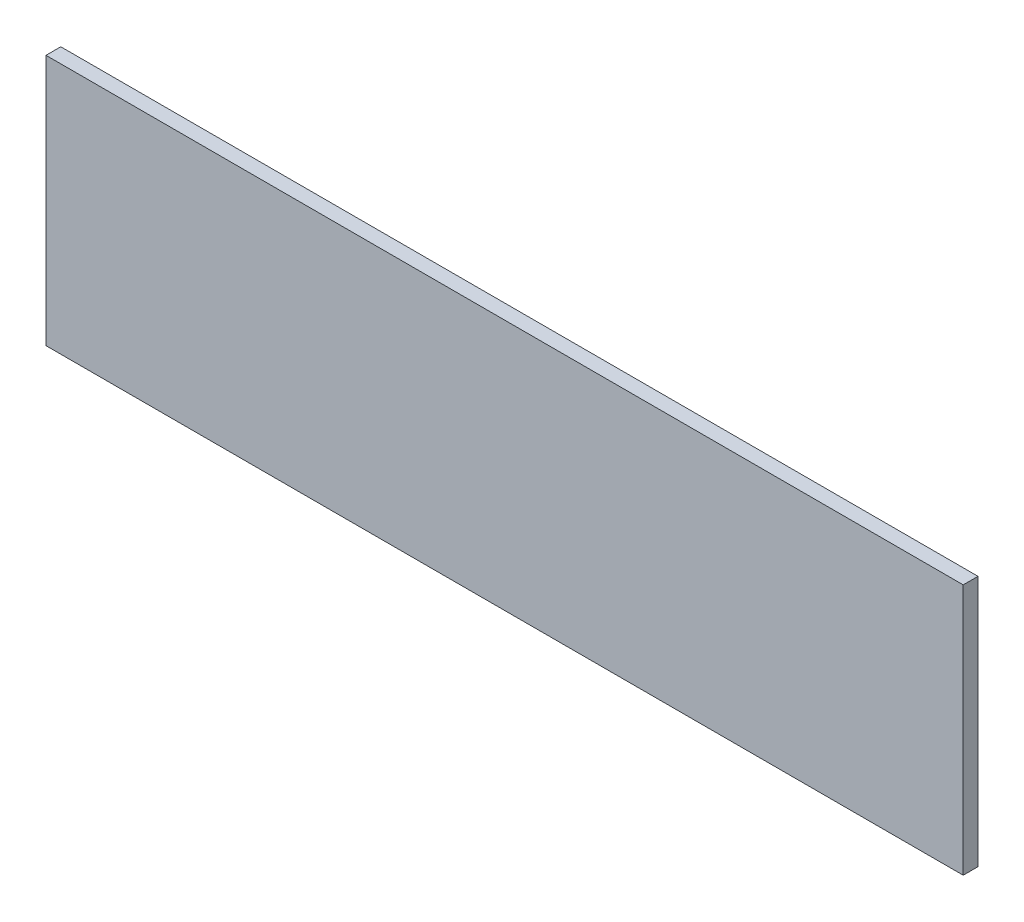
ISO-10303-21;
HEADER;
FILE_DESCRIPTION(('STEP AP214'),'2;1');
FILE_NAME('part.step','',(''),(''),'','','');
FILE_SCHEMA(('AUTOMOTIVE_DESIGN { 1 0 10303 214 1 1 1 1 }'));
ENDSEC;
DATA;
#1=APPLICATION_CONTEXT('core data for automotive mechanical design processes');
#2=APPLICATION_PROTOCOL_DEFINITION('international standard','automotive_design',2000,#1);
#3=PRODUCT_CONTEXT('',#1,'mechanical');
#4=PRODUCT('Part','Part','',(#3));
#5=PRODUCT_RELATED_PRODUCT_CATEGORY('part','',(#4));
#6=PRODUCT_DEFINITION_FORMATION('','',#4);
#7=PRODUCT_DEFINITION_CONTEXT('part definition',#1,'design');
#8=PRODUCT_DEFINITION('design','',#6,#7);
#9=PRODUCT_DEFINITION_SHAPE('','',#8);
#10=(LENGTH_UNIT() NAMED_UNIT(*) SI_UNIT(.MILLI.,.METRE.));
#11=(NAMED_UNIT(*) PLANE_ANGLE_UNIT() SI_UNIT($,.RADIAN.));
#12=(NAMED_UNIT(*) SI_UNIT($,.STERADIAN.) SOLID_ANGLE_UNIT());
#13=UNCERTAINTY_MEASURE_WITH_UNIT(LENGTH_MEASURE(1.E-05),#10,'distance_accuracy_value','');
#14=(GEOMETRIC_REPRESENTATION_CONTEXT(3) GLOBAL_UNCERTAINTY_ASSIGNED_CONTEXT((#13)) GLOBAL_UNIT_ASSIGNED_CONTEXT((#10,
#11,#12)) REPRESENTATION_CONTEXT('',''));
#15=CARTESIAN_POINT('',(0.,0.,0.));
#16=DIRECTION('',(0.,0.,1.));
#17=DIRECTION('',(1.,0.,0.));
#18=AXIS2_PLACEMENT_3D('',#15,#16,#17);
#19=CARTESIAN_POINT('',(62.,-17.,2.));
#20=DIRECTION('',(-1.,0.,0.));
#21=DIRECTION('',(0.,0.,1.));
#22=AXIS2_PLACEMENT_3D('',#19,#20,#21);
#23=PLANE('',#22);
#24=DIRECTION('',(0.,1.,0.));
#25=VECTOR('',#24,1.);
#26=CARTESIAN_POINT('',(62.,-17.,0.));
#27=LINE('',#26,#25);
#28=CARTESIAN_POINT('',(62.,-17.,0.));
#29=VERTEX_POINT('',#28);
#30=CARTESIAN_POINT('',(62.,17.,0.));
#31=VERTEX_POINT('',#30);
#32=EDGE_CURVE('E96',#29,#31,#27,.T.);
#33=ORIENTED_EDGE('',*,*,#32,.T.);
#34=DIRECTION('',(0.,0.,-1.));
#35=VECTOR('',#34,1.);
#36=CARTESIAN_POINT('',(62.,17.,2.));
#37=LINE('',#36,#35);
#38=CARTESIAN_POINT('',(62.,17.,2.));
#39=VERTEX_POINT('',#38);
#40=EDGE_CURVE('E11',#39,#31,#37,.T.);
#41=ORIENTED_EDGE('',*,*,#40,.F.);
#42=DIRECTION('',(0.,1.,0.));
#43=VECTOR('',#42,1.);
#44=CARTESIAN_POINT('',(62.,-17.,2.));
#45=LINE('',#44,#43);
#46=CARTESIAN_POINT('',(62.,-17.,2.));
#47=VERTEX_POINT('',#46);
#48=EDGE_CURVE('E84',#47,#39,#45,.T.);
#49=ORIENTED_EDGE('',*,*,#48,.F.);
#50=DIRECTION('',(0.,0.,-1.));
#51=VECTOR('',#50,1.);
#52=CARTESIAN_POINT('',(62.,-17.,2.));
#53=LINE('',#52,#51);
#54=EDGE_CURVE('E92',#47,#29,#53,.T.);
#55=ORIENTED_EDGE('',*,*,#54,.T.);
#56=EDGE_LOOP('',(#33,#41,#49,#55));
#57=FACE_BOUND('',#56,.T.);
#58=ADVANCED_FACE('F33',(#57),#23,.F.);
#59=CARTESIAN_POINT('',(-62.,17.,2.));
#60=DIRECTION('',(0.,-1.,0.));
#61=DIRECTION('',(0.,0.,-1.));
#62=AXIS2_PLACEMENT_3D('',#59,#60,#61);
#63=PLANE('',#62);
#64=DIRECTION('',(-1.,0.,0.));
#65=VECTOR('',#64,1.);
#66=CARTESIAN_POINT('',(-62.,17.,0.));
#67=LINE('',#66,#65);
#68=CARTESIAN_POINT('',(-62.,17.,0.));
#69=VERTEX_POINT('',#68);
#70=EDGE_CURVE('E88',#31,#69,#67,.T.);
#71=ORIENTED_EDGE('',*,*,#70,.T.);
#72=DIRECTION('',(0.,0.,-1.));
#73=VECTOR('',#72,1.);
#74=CARTESIAN_POINT('',(-62.,17.,2.));
#75=LINE('',#74,#73);
#76=CARTESIAN_POINT('',(-62.,17.,2.));
#77=VERTEX_POINT('',#76);
#78=EDGE_CURVE('E41',#77,#69,#75,.T.);
#79=ORIENTED_EDGE('',*,*,#78,.F.);
#80=DIRECTION('',(-1.,0.,0.));
#81=VECTOR('',#80,1.);
#82=CARTESIAN_POINT('',(-62.,17.,2.));
#83=LINE('',#82,#81);
#84=EDGE_CURVE('E79',#39,#77,#83,.T.);
#85=ORIENTED_EDGE('',*,*,#84,.F.);
#86=ORIENTED_EDGE('',*,*,#40,.T.);
#87=EDGE_LOOP('',(#71,#79,#85,#86));
#88=FACE_BOUND('',#87,.T.);
#89=ADVANCED_FACE('F87',(#88),#63,.F.);
#90=CARTESIAN_POINT('',(-62.,-17.,2.));
#91=DIRECTION('',(1.,0.,0.));
#92=DIRECTION('',(0.,0.,-1.));
#93=AXIS2_PLACEMENT_3D('',#90,#91,#92);
#94=PLANE('',#93);
#95=DIRECTION('',(0.,-1.,0.));
#96=VECTOR('',#95,1.);
#97=CARTESIAN_POINT('',(-62.,-17.,0.));
#98=LINE('',#97,#96);
#99=CARTESIAN_POINT('',(-62.,-17.,0.));
#100=VERTEX_POINT('',#99);
#101=EDGE_CURVE('E66',#69,#100,#98,.T.);
#102=ORIENTED_EDGE('',*,*,#101,.T.);
#103=DIRECTION('',(0.,0.,-1.));
#104=VECTOR('',#103,1.);
#105=CARTESIAN_POINT('',(-62.,-17.,2.));
#106=LINE('',#105,#104);
#107=CARTESIAN_POINT('',(-62.,-17.,2.));
#108=VERTEX_POINT('',#107);
#109=EDGE_CURVE('E89',#108,#100,#106,.T.);
#110=ORIENTED_EDGE('',*,*,#109,.F.);
#111=DIRECTION('',(0.,-1.,0.));
#112=VECTOR('',#111,1.);
#113=CARTESIAN_POINT('',(-62.,-17.,2.));
#114=LINE('',#113,#112);
#115=EDGE_CURVE('E82',#77,#108,#114,.T.);
#116=ORIENTED_EDGE('',*,*,#115,.F.);
#117=ORIENTED_EDGE('',*,*,#78,.T.);
#118=EDGE_LOOP('',(#102,#110,#116,#117));
#119=FACE_BOUND('',#118,.T.);
#120=ADVANCED_FACE('F90',(#119),#94,.F.);
#121=CARTESIAN_POINT('',(-62.,-17.,2.));
#122=DIRECTION('',(0.,1.,0.));
#123=DIRECTION('',(-1.,0.,0.));
#124=AXIS2_PLACEMENT_3D('',#121,#122,#123);
#125=PLANE('',#124);
#126=DIRECTION('',(1.,0.,0.));
#127=VECTOR('',#126,1.);
#128=CARTESIAN_POINT('',(-62.,-17.,0.));
#129=LINE('',#128,#127);
#130=EDGE_CURVE('E72',#100,#29,#129,.T.);
#131=ORIENTED_EDGE('',*,*,#130,.T.);
#132=ORIENTED_EDGE('',*,*,#54,.F.);
#133=DIRECTION('',(1.,0.,0.));
#134=VECTOR('',#133,1.);
#135=CARTESIAN_POINT('',(-62.,-17.,2.));
#136=LINE('',#135,#134);
#137=EDGE_CURVE('E49',#108,#47,#136,.T.);
#138=ORIENTED_EDGE('',*,*,#137,.F.);
#139=ORIENTED_EDGE('',*,*,#109,.T.);
#140=EDGE_LOOP('',(#131,#132,#138,#139));
#141=FACE_BOUND('',#140,.T.);
#142=ADVANCED_FACE('F103',(#141),#125,.F.);
#143=CARTESIAN_POINT('',(0.,0.,2.));
#144=DIRECTION('',(0.,0.,-1.));
#145=DIRECTION('',(-1.,0.,0.));
#146=AXIS2_PLACEMENT_3D('',#143,#144,#145);
#147=PLANE('',#146);
#148=ORIENTED_EDGE('',*,*,#48,.T.);
#149=ORIENTED_EDGE('',*,*,#84,.T.);
#150=ORIENTED_EDGE('',*,*,#115,.T.);
#151=ORIENTED_EDGE('',*,*,#137,.T.);
#152=EDGE_LOOP('',(#148,#149,#150,#151));
#153=FACE_BOUND('',#152,.T.);
#154=ADVANCED_FACE('F80',(#153),#147,.F.);
#155=CARTESIAN_POINT('',(0.,0.,0.));
#156=DIRECTION('',(0.,0.,-1.));
#157=DIRECTION('',(-1.,0.,0.));
#158=AXIS2_PLACEMENT_3D('',#155,#156,#157);
#159=PLANE('',#158);
#160=ORIENTED_EDGE('',*,*,#32,.F.);
#161=ORIENTED_EDGE('',*,*,#130,.F.);
#162=ORIENTED_EDGE('',*,*,#101,.F.);
#163=ORIENTED_EDGE('',*,*,#70,.F.);
#164=EDGE_LOOP('',(#160,#161,#162,#163));
#165=FACE_BOUND('',#164,.T.);
#166=ADVANCED_FACE('F106',(#165),#159,.T.);
#167=CLOSED_SHELL('',(#58,#89,#120,#142,#154,#166));
#168=MANIFOLD_SOLID_BREP('B2',#167);
#169=ADVANCED_BREP_SHAPE_REPRESENTATION('',(#18,#168),#14);
#170=SHAPE_DEFINITION_REPRESENTATION(#9,#169);
ENDSEC;
END-ISO-10303-21;
